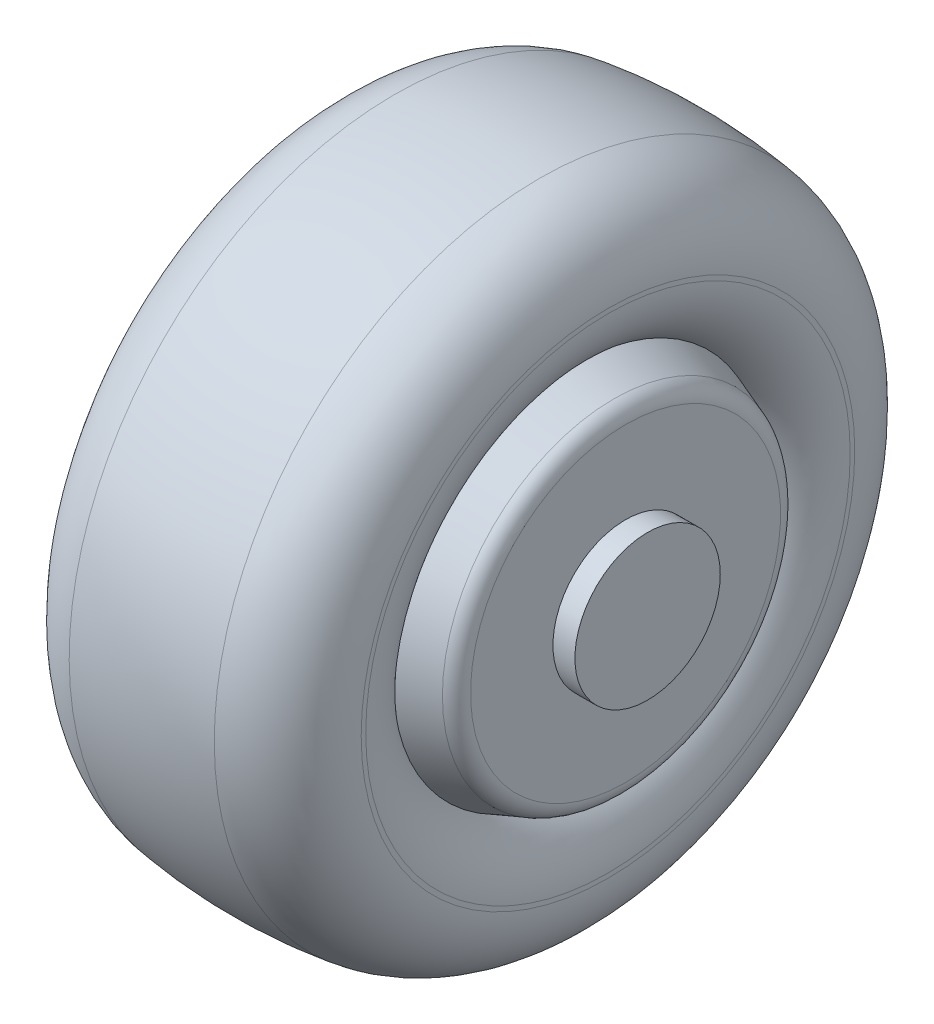
ISO-10303-21;
HEADER;
FILE_DESCRIPTION(('STEP AP214'),'2;1');
FILE_NAME('part.step','',(''),(''),'','','');
FILE_SCHEMA(('AUTOMOTIVE_DESIGN { 1 0 10303 214 1 1 1 1 }'));
ENDSEC;
DATA;
#1=APPLICATION_CONTEXT('core data for automotive mechanical design processes');
#2=APPLICATION_PROTOCOL_DEFINITION('international standard','automotive_design',2000,#1);
#3=PRODUCT_CONTEXT('',#1,'mechanical');
#4=PRODUCT('Part','Part','',(#3));
#5=PRODUCT_RELATED_PRODUCT_CATEGORY('part','',(#4));
#6=PRODUCT_DEFINITION_FORMATION('','',#4);
#7=PRODUCT_DEFINITION_CONTEXT('part definition',#1,'design');
#8=PRODUCT_DEFINITION('design','',#6,#7);
#9=PRODUCT_DEFINITION_SHAPE('','',#8);
#10=(LENGTH_UNIT() NAMED_UNIT(*) SI_UNIT(.MILLI.,.METRE.));
#11=(NAMED_UNIT(*) PLANE_ANGLE_UNIT() SI_UNIT($,.RADIAN.));
#12=(NAMED_UNIT(*) SI_UNIT($,.STERADIAN.) SOLID_ANGLE_UNIT());
#13=UNCERTAINTY_MEASURE_WITH_UNIT(LENGTH_MEASURE(1.E-05),#10,'distance_accuracy_value','');
#14=(GEOMETRIC_REPRESENTATION_CONTEXT(3) GLOBAL_UNCERTAINTY_ASSIGNED_CONTEXT((#13)) GLOBAL_UNIT_ASSIGNED_CONTEXT((#10,
#11,#12)) REPRESENTATION_CONTEXT('',''));
#15=CARTESIAN_POINT('',(0.,0.,0.));
#16=DIRECTION('',(0.,0.,1.));
#17=DIRECTION('',(1.,0.,0.));
#18=AXIS2_PLACEMENT_3D('',#15,#16,#17);
#19=CARTESIAN_POINT('',(20.5000021,0.,0.));
#20=DIRECTION('',(1.,0.,0.));
#21=DIRECTION('',(0.,0.,-1.));
#22=AXIS2_PLACEMENT_3D('',#19,#20,#21);
#23=PLANE('',#22);
#24=CARTESIAN_POINT('',(20.5000021,0.,0.));
#25=DIRECTION('',(1.,0.,0.));
#26=DIRECTION('',(0.,0.,-1.));
#27=AXIS2_PLACEMENT_3D('',#24,#25,#26);
#28=CIRCLE('',#27,8.25);
#29=CARTESIAN_POINT('',(20.5000021,0.,-8.25));
#30=VERTEX_POINT('',#29);
#31=EDGE_CURVE('E447',#30,#30,#28,.F.);
#32=ORIENTED_EDGE('',*,*,#31,.F.);
#33=EDGE_LOOP('',(#32));
#34=FACE_BOUND('',#33,.T.);
#35=ADVANCED_FACE('F17',(#34),#23,.T.);
#36=CARTESIAN_POINT('',(-20.5000021,0.,0.));
#37=DIRECTION('',(1.,0.,0.));
#38=DIRECTION('',(0.,0.,-1.));
#39=AXIS2_PLACEMENT_3D('',#36,#37,#38);
#40=PLANE('',#39);
#41=CARTESIAN_POINT('',(-20.5000021,0.,0.));
#42=DIRECTION('',(1.,0.,0.));
#43=DIRECTION('',(0.,0.,-1.));
#44=AXIS2_PLACEMENT_3D('',#41,#42,#43);
#45=CIRCLE('',#44,8.25);
#46=CARTESIAN_POINT('',(-20.5000021,0.,-8.25));
#47=VERTEX_POINT('',#46);
#48=EDGE_CURVE('E444',#47,#47,#45,.T.);
#49=ORIENTED_EDGE('',*,*,#48,.F.);
#50=EDGE_LOOP('',(#49));
#51=FACE_BOUND('',#50,.T.);
#52=ADVANCED_FACE('F160',(#51),#40,.F.);
#53=CARTESIAN_POINT('',(-22.55000231,0.,0.));
#54=DIRECTION('',(1.,0.,0.));
#55=DIRECTION('',(0.,0.,-1.));
#56=AXIS2_PLACEMENT_3D('',#53,#54,#55);
#57=CYLINDRICAL_SURFACE('',#56,8.25);
#58=ORIENTED_EDGE('',*,*,#31,.T.);
#59=EDGE_LOOP('',(#58));
#60=FACE_BOUND('',#59,.T.);
#61=CARTESIAN_POINT('',(18.0000021,0.,0.));
#62=DIRECTION('',(1.,0.,0.));
#63=DIRECTION('',(0.,0.,-1.));
#64=AXIS2_PLACEMENT_3D('',#61,#62,#63);
#65=CIRCLE('',#64,8.25);
#66=CARTESIAN_POINT('',(18.0000021,0.,-8.25));
#67=VERTEX_POINT('',#66);
#68=EDGE_CURVE('E442',#67,#67,#65,.F.);
#69=ORIENTED_EDGE('',*,*,#68,.F.);
#70=EDGE_LOOP('',(#69));
#71=FACE_BOUND('',#70,.T.);
#72=ADVANCED_FACE('F156',(#60,#71),#57,.T.);
#73=CARTESIAN_POINT('',(-22.55000231,0.,0.));
#74=DIRECTION('',(1.,0.,0.));
#75=DIRECTION('',(0.,0.,-1.));
#76=AXIS2_PLACEMENT_3D('',#73,#74,#75);
#77=CYLINDRICAL_SURFACE('',#76,8.25);
#78=ORIENTED_EDGE('',*,*,#48,.T.);
#79=EDGE_LOOP('',(#78));
#80=FACE_BOUND('',#79,.T.);
#81=CARTESIAN_POINT('',(-18.0000021,0.,0.));
#82=DIRECTION('',(1.,0.,0.));
#83=DIRECTION('',(0.,0.,-1.));
#84=AXIS2_PLACEMENT_3D('',#81,#82,#83);
#85=CIRCLE('',#84,8.25);
#86=CARTESIAN_POINT('',(-18.0000021,0.,-8.25));
#87=VERTEX_POINT('',#86);
#88=EDGE_CURVE('E74',#87,#87,#85,.F.);
#89=ORIENTED_EDGE('',*,*,#88,.T.);
#90=EDGE_LOOP('',(#89));
#91=FACE_BOUND('',#90,.T.);
#92=ADVANCED_FACE('F151',(#80,#91),#77,.T.);
#93=CARTESIAN_POINT('',(18.0000021,0.,0.));
#94=DIRECTION('',(1.,0.,0.));
#95=DIRECTION('',(0.,0.,-1.));
#96=AXIS2_PLACEMENT_3D('',#93,#94,#95);
#97=PLANE('',#96);
#98=ORIENTED_EDGE('',*,*,#68,.T.);
#99=EDGE_LOOP('',(#98));
#100=FACE_BOUND('',#99,.T.);
#101=CARTESIAN_POINT('',(18.000002100002,0.,0.));
#102=DIRECTION('',(-1.,0.,0.));
#103=DIRECTION('',(0.,-1.,0.));
#104=AXIS2_PLACEMENT_3D('',#101,#102,#103);
#105=CIRCLE('',#104,17.59960140316);
#106=CARTESIAN_POINT('',(18.0000021000012,-17.59960140316,0.));
#107=VERTEX_POINT('',#106);
#108=CARTESIAN_POINT('',(18.0000021000012,17.59960140316,0.));
#109=VERTEX_POINT('',#108);
#110=EDGE_CURVE('E72',#107,#109,#105,.T.);
#111=ORIENTED_EDGE('',*,*,#110,.F.);
#112=CARTESIAN_POINT('',(18.000002100002,0.,0.));
#113=DIRECTION('',(-1.,0.,0.));
#114=DIRECTION('',(0.,1.,0.));
#115=AXIS2_PLACEMENT_3D('',#112,#113,#114);
#116=CIRCLE('',#115,17.59960140316);
#117=EDGE_CURVE('E67',#109,#107,#116,.T.);
#118=ORIENTED_EDGE('',*,*,#117,.F.);
#119=EDGE_LOOP('',(#111,#118));
#120=FACE_BOUND('',#119,.T.);
#121=ADVANCED_FACE('F71',(#100,#120),#97,.T.);
#122=CARTESIAN_POINT('',(-18.0000021,0.,0.));
#123=DIRECTION('',(1.,0.,0.));
#124=DIRECTION('',(0.,0.,-1.));
#125=AXIS2_PLACEMENT_3D('',#122,#123,#124);
#126=PLANE('',#125);
#127=ORIENTED_EDGE('',*,*,#88,.F.);
#128=EDGE_LOOP('',(#127));
#129=FACE_BOUND('',#128,.T.);
#130=CARTESIAN_POINT('',(-18.000002099996,0.,0.));
#131=DIRECTION('',(1.,0.,0.));
#132=DIRECTION('',(0.,-1.,0.));
#133=AXIS2_PLACEMENT_3D('',#130,#131,#132);
#134=CIRCLE('',#133,17.59959215869);
#135=CARTESIAN_POINT('',(-18.0000020999976,-17.59959215869,0.));
#136=VERTEX_POINT('',#135);
#137=CARTESIAN_POINT('',(-18.0000020999976,17.59959215869,0.));
#138=VERTEX_POINT('',#137);
#139=EDGE_CURVE('E114',#136,#138,#134,.T.);
#140=ORIENTED_EDGE('',*,*,#139,.F.);
#141=CARTESIAN_POINT('',(-18.000002099996,0.,0.));
#142=DIRECTION('',(1.,0.,0.));
#143=DIRECTION('',(0.,1.,0.));
#144=AXIS2_PLACEMENT_3D('',#141,#142,#143);
#145=CIRCLE('',#144,17.59959215869);
#146=EDGE_CURVE('E80',#138,#136,#145,.T.);
#147=ORIENTED_EDGE('',*,*,#146,.F.);
#148=EDGE_LOOP('',(#140,#147));
#149=FACE_BOUND('',#148,.T.);
#150=ADVANCED_FACE('F100',(#129,#149),#126,.F.);
#151=CARTESIAN_POINT('',(16.00000209977,0.,0.));
#152=DIRECTION('',(1.,0.,0.));
#153=DIRECTION('',(0.,-1.,0.));
#154=AXIS2_PLACEMENT_3D('',#151,#152,#153);
#155=TOROIDAL_SURFACE('',#154,17.59960140316,2.000000000232);
#156=ORIENTED_EDGE('',*,*,#117,.T.);
#157=ORIENTED_EDGE('',*,*,#110,.T.);
#158=EDGE_LOOP('',(#156,#157));
#159=FACE_BOUND('',#158,.T.);
#160=CARTESIAN_POINT('',(16.6840353515506,0.,0.));
#161=DIRECTION('',(-1.,0.,0.));
#162=DIRECTION('',(0.,1.,0.));
#163=AXIS2_PLACEMENT_3D('',#160,#161,#162);
#164=CIRCLE('',#163,19.4789892054143);
#165=CARTESIAN_POINT('',(16.6840353515507,19.4789892054143,0.));
#166=VERTEX_POINT('',#165);
#167=EDGE_CURVE('E109',#166,#166,#164,.T.);
#168=ORIENTED_EDGE('',*,*,#167,.F.);
#169=EDGE_LOOP('',(#168));
#170=FACE_BOUND('',#169,.T.);
#171=ADVANCED_FACE('F78',(#159,#170),#155,.T.);
#172=CARTESIAN_POINT('',(-16.00000210017,0.,0.));
#173=DIRECTION('',(1.,0.,0.));
#174=DIRECTION('',(0.,-1.,0.));
#175=AXIS2_PLACEMENT_3D('',#172,#173,#174);
#176=TOROIDAL_SURFACE('',#175,17.59959215869,1.999999999826);
#177=ORIENTED_EDGE('',*,*,#146,.T.);
#178=ORIENTED_EDGE('',*,*,#139,.T.);
#179=EDGE_LOOP('',(#177,#178));
#180=FACE_BOUND('',#179,.T.);
#181=CARTESIAN_POINT('',(-16.6840381883665,0.,0.));
#182=DIRECTION('',(1.,0.,0.));
#183=DIRECTION('',(0.,-1.,0.));
#184=AXIS2_PLACEMENT_3D('',#181,#182,#183);
#185=CIRCLE('',#184,19.4789789281603);
#186=CARTESIAN_POINT('',(-16.6840381883665,-19.4789789281603,0.));
#187=VERTEX_POINT('',#186);
#188=EDGE_CURVE('E292',#187,#187,#185,.T.);
#189=ORIENTED_EDGE('',*,*,#188,.F.);
#190=EDGE_LOOP('',(#189));
#191=FACE_BOUND('',#190,.T.);
#192=ADVANCED_FACE('F99',(#180,#191),#176,.T.);
#193=CARTESIAN_POINT('',(12.6099945575885,0.,0.));
#194=DIRECTION('',(-1.,0.,0.));
#195=DIRECTION('',(0.,0.,1.));
#196=AXIS2_PLACEMENT_3D('',#193,#194,#195);
#197=CONICAL_SURFACE('',#196,20.961801516746,0.349062107046291);
#198=ORIENTED_EDGE('',*,*,#167,.T.);
#199=EDGE_LOOP('',(#198));
#200=FACE_BOUND('',#199,.T.);
#201=CARTESIAN_POINT('',(12.609994557591,0.,0.));
#202=DIRECTION('',(1.,0.,0.));
#203=DIRECTION('',(0.,-1.,0.));
#204=AXIS2_PLACEMENT_3D('',#201,#202,#203);
#205=CIRCLE('',#204,20.9618015167486);
#206=CARTESIAN_POINT('',(12.609994557591,-20.9618015167486,0.));
#207=VERTEX_POINT('',#206);
#208=EDGE_CURVE('E289',#207,#207,#205,.F.);
#209=ORIENTED_EDGE('',*,*,#208,.F.);
#210=EDGE_LOOP('',(#209));
#211=FACE_BOUND('',#210,.T.);
#212=ADVANCED_FACE('F318',(#200,#211),#197,.T.);
#213=CARTESIAN_POINT('',(-12.609999212348,0.,0.));
#214=DIRECTION('',(1.,0.,0.));
#215=DIRECTION('',(0.,0.,-1.));
#216=AXIS2_PLACEMENT_3D('',#213,#214,#215);
#217=CONICAL_SURFACE('',#216,20.9617975423545,0.349063616567947);
#218=ORIENTED_EDGE('',*,*,#188,.T.);
#219=EDGE_LOOP('',(#218));
#220=FACE_BOUND('',#219,.T.);
#221=CARTESIAN_POINT('',(-12.6099992123504,0.,0.));
#222=DIRECTION('',(1.,0.,0.));
#223=DIRECTION('',(0.,-1.,0.));
#224=AXIS2_PLACEMENT_3D('',#221,#222,#223);
#225=CIRCLE('',#224,20.9617975423594);
#226=CARTESIAN_POINT('',(-12.6099992123504,-20.9617975423594,0.));
#227=VERTEX_POINT('',#226);
#228=EDGE_CURVE('E280',#227,#227,#225,.T.);
#229=ORIENTED_EDGE('',*,*,#228,.F.);
#230=EDGE_LOOP('',(#229));
#231=FACE_BOUND('',#230,.T.);
#232=ADVANCED_FACE('F322',(#220,#231),#217,.T.);
#233=CARTESIAN_POINT('',(7.9999977,0.,0.));
#234=DIRECTION('',(1.,0.,0.));
#235=DIRECTION('',(0.,-1.,0.));
#236=AXIS2_PLACEMENT_3D('',#233,#234,#235);
#237=TOROIDAL_SURFACE('',#236,27.4999958,8.000003469533);
#238=ORIENTED_EDGE('',*,*,#208,.T.);
#239=EDGE_LOOP('',(#238));
#240=FACE_BOUND('',#239,.T.);
#241=CARTESIAN_POINT('',(16.000001169533,0.,0.));
#242=DIRECTION('',(1.,0.,0.));
#243=DIRECTION('',(0.,1.,0.));
#244=AXIS2_PLACEMENT_3D('',#241,#242,#243);
#245=CIRCLE('',#244,27.4999958);
#246=CARTESIAN_POINT('',(16.0000041347665,-27.4999958,0.));
#247=VERTEX_POINT('',#246);
#248=CARTESIAN_POINT('',(16.0000041347665,27.4999958,0.));
#249=VERTEX_POINT('',#248);
#250=EDGE_CURVE('E275',#247,#249,#245,.F.);
#251=ORIENTED_EDGE('',*,*,#250,.F.);
#252=CARTESIAN_POINT('',(16.000001169533,0.,0.));
#253=DIRECTION('',(1.,0.,0.));
#254=DIRECTION('',(0.,-1.,0.));
#255=AXIS2_PLACEMENT_3D('',#252,#253,#254);
#256=CIRCLE('',#255,27.4999958);
#257=EDGE_CURVE('E288',#249,#247,#256,.F.);
#258=ORIENTED_EDGE('',*,*,#257,.F.);
#259=EDGE_LOOP('',(#251,#258));
#260=FACE_BOUND('',#259,.T.);
#261=ADVANCED_FACE('F248',(#240,#260),#237,.T.);
#262=CARTESIAN_POINT('',(-7.9999977,0.,0.));
#263=DIRECTION('',(1.,0.,0.));
#264=DIRECTION('',(0.,-1.,0.));
#265=AXIS2_PLACEMENT_3D('',#262,#263,#264);
#266=TOROIDAL_SURFACE('',#265,27.4999958,8.0000094);
#267=ORIENTED_EDGE('',*,*,#228,.T.);
#268=EDGE_LOOP('',(#267));
#269=FACE_BOUND('',#268,.T.);
#270=CARTESIAN_POINT('',(-16.0000071,0.,0.));
#271=DIRECTION('',(-1.,0.,0.));
#272=DIRECTION('',(0.,1.,0.));
#273=AXIS2_PLACEMENT_3D('',#270,#271,#272);
#274=CIRCLE('',#273,27.4999958);
#275=CARTESIAN_POINT('',(-16.0000071,27.4999958,0.));
#276=VERTEX_POINT('',#275);
#277=CARTESIAN_POINT('',(-16.0000071,-27.4999958,0.));
#278=VERTEX_POINT('',#277);
#279=EDGE_CURVE('E262',#276,#278,#274,.T.);
#280=ORIENTED_EDGE('',*,*,#279,.T.);
#281=CARTESIAN_POINT('',(-16.0000071,0.,0.));
#282=DIRECTION('',(-1.,0.,0.));
#283=DIRECTION('',(0.,-1.,0.));
#284=AXIS2_PLACEMENT_3D('',#281,#282,#283);
#285=CIRCLE('',#284,27.4999958);
#286=EDGE_CURVE('E229',#278,#276,#285,.T.);
#287=ORIENTED_EDGE('',*,*,#286,.T.);
#288=EDGE_LOOP('',(#280,#287));
#289=FACE_BOUND('',#288,.T.);
#290=ADVANCED_FACE('F236',(#269,#289),#266,.T.);
#291=CARTESIAN_POINT('',(16.0000071,0.,0.));
#292=DIRECTION('',(1.,0.,0.));
#293=DIRECTION('',(0.,0.,-1.));
#294=AXIS2_PLACEMENT_3D('',#291,#292,#293);
#295=PLANE('',#294);
#296=ORIENTED_EDGE('',*,*,#257,.T.);
#297=ORIENTED_EDGE('',*,*,#250,.T.);
#298=EDGE_LOOP('',(#296,#297));
#299=FACE_BOUND('',#298,.T.);
#300=CARTESIAN_POINT('',(16.0000071,0.,0.));
#301=DIRECTION('',(-1.,0.,0.));
#302=DIRECTION('',(0.,1.,0.));
#303=AXIS2_PLACEMENT_3D('',#300,#301,#302);
#304=CIRCLE('',#303,28.01732689878);
#305=CARTESIAN_POINT('',(16.0000071,28.01732689878,0.));
#306=VERTEX_POINT('',#305);
#307=CARTESIAN_POINT('',(16.0000071,-28.01732689878,0.));
#308=VERTEX_POINT('',#307);
#309=EDGE_CURVE('E186',#306,#308,#304,.T.);
#310=ORIENTED_EDGE('',*,*,#309,.F.);
#311=CARTESIAN_POINT('',(16.0000071,0.,0.));
#312=DIRECTION('',(-1.,0.,0.));
#313=DIRECTION('',(0.,-1.,0.));
#314=AXIS2_PLACEMENT_3D('',#311,#312,#313);
#315=CIRCLE('',#314,28.01732689878);
#316=EDGE_CURVE('E217',#308,#306,#315,.T.);
#317=ORIENTED_EDGE('',*,*,#316,.F.);
#318=EDGE_LOOP('',(#310,#317));
#319=FACE_BOUND('',#318,.T.);
#320=ADVANCED_FACE('F247',(#299,#319),#295,.T.);
#321=CARTESIAN_POINT('',(-16.0000071,0.,0.));
#322=DIRECTION('',(1.,0.,0.));
#323=DIRECTION('',(0.,0.,-1.));
#324=AXIS2_PLACEMENT_3D('',#321,#322,#323);
#325=PLANE('',#324);
#326=ORIENTED_EDGE('',*,*,#286,.F.);
#327=ORIENTED_EDGE('',*,*,#279,.F.);
#328=EDGE_LOOP('',(#326,#327));
#329=FACE_BOUND('',#328,.T.);
#330=CARTESIAN_POINT('',(-16.0000071,0.,0.));
#331=DIRECTION('',(1.,0.,0.));
#332=DIRECTION('',(0.,-1.,0.));
#333=AXIS2_PLACEMENT_3D('',#330,#331,#332);
#334=CIRCLE('',#333,28.01732337919);
#335=CARTESIAN_POINT('',(-16.0000071,-28.01732337919,0.));
#336=VERTEX_POINT('',#335);
#337=CARTESIAN_POINT('',(-16.0000071,28.01732337919,0.));
#338=VERTEX_POINT('',#337);
#339=EDGE_CURVE('E184',#336,#338,#334,.T.);
#340=ORIENTED_EDGE('',*,*,#339,.F.);
#341=CARTESIAN_POINT('',(-16.0000071,0.,0.));
#342=DIRECTION('',(1.,0.,0.));
#343=DIRECTION('',(0.,1.,0.));
#344=AXIS2_PLACEMENT_3D('',#341,#342,#343);
#345=CIRCLE('',#344,28.01732337919);
#346=EDGE_CURVE('E37',#338,#336,#345,.T.);
#347=ORIENTED_EDGE('',*,*,#346,.F.);
#348=EDGE_LOOP('',(#340,#347));
#349=FACE_BOUND('',#348,.T.);
#350=ADVANCED_FACE('F346',(#329,#349),#325,.F.);
#351=CARTESIAN_POINT('',(7.0000071,0.,0.));
#352=DIRECTION('',(1.,0.,0.));
#353=DIRECTION('',(0.,-1.,0.));
#354=AXIS2_PLACEMENT_3D('',#351,#352,#353);
#355=TOROIDAL_SURFACE('',#354,28.01732689878,9.);
#356=CARTESIAN_POINT('',(8.23530003359825,0.,6.2376319387436E-12));
#357=DIRECTION('',(-1.,0.,0.));
#358=DIRECTION('',(0.,-0.998026728428283,0.062790519529136));
#359=AXIS2_PLACEMENT_3D('',#356,#357,#358);
#360=CIRCLE('',#359,36.9321489030744);
#361=CARTESIAN_POINT('',(8.23530003359793,-36.8592717435616,2.31898881695769));
#362=VERTEX_POINT('',#361);
#363=EDGE_CURVE('E29',#362,#362,#360,.T.);
#364=ORIENTED_EDGE('',*,*,#363,.F.);
#365=EDGE_LOOP('',(#364));
#366=FACE_BOUND('',#365,.T.);
#367=ORIENTED_EDGE('',*,*,#309,.T.);
#368=ORIENTED_EDGE('',*,*,#316,.T.);
#369=EDGE_LOOP('',(#367,#368));
#370=FACE_BOUND('',#369,.T.);
#371=ADVANCED_FACE('F176',(#366,#370),#355,.T.);
#372=CARTESIAN_POINT('',(-7.0000071,0.,0.));
#373=DIRECTION('',(1.,0.,0.));
#374=DIRECTION('',(0.,-1.,0.));
#375=AXIS2_PLACEMENT_3D('',#372,#373,#374);
#376=TOROIDAL_SURFACE('',#375,28.01732337919,9.);
#377=ORIENTED_EDGE('',*,*,#346,.T.);
#378=ORIENTED_EDGE('',*,*,#339,.T.);
#379=EDGE_LOOP('',(#377,#378));
#380=FACE_BOUND('',#379,.T.);
#381=CARTESIAN_POINT('',(-8.23530451595129,0.,7.95132189257419E-12));
#382=DIRECTION('',(1.,0.,0.));
#383=DIRECTION('',(0.,-0.998026728428285,0.0627905195290917));
#384=AXIS2_PLACEMENT_3D('',#381,#382,#383);
#385=CIRCLE('',#384,36.9321447623834);
#386=CARTESIAN_POINT('',(-8.23530451595095,-36.8592676110413,2.31898855696163));
#387=VERTEX_POINT('',#386);
#388=EDGE_CURVE('E11',#387,#387,#385,.T.);
#389=ORIENTED_EDGE('',*,*,#388,.F.);
#390=EDGE_LOOP('',(#389));
#391=FACE_BOUND('',#390,.T.);
#392=ADVANCED_FACE('F171',(#380,#391),#376,.T.);
#393=CARTESIAN_POINT('',(1.26999754305517E-05,0.,9.14546216534973E-12));
#394=DIRECTION('',(1.,0.,0.));
#395=DIRECTION('',(0.,1.,0.));
#396=AXIS2_PLACEMENT_3D('',#393,#394,#395);
#397=DEGENERATE_TOROIDAL_SURFACE('',#396,22.5000058002944,60.0000080845959,.F.);
#398=ORIENTED_EDGE('',*,*,#388,.T.);
#399=EDGE_LOOP('',(#398));
#400=FACE_BOUND('',#399,.T.);
#401=ORIENTED_EDGE('',*,*,#363,.T.);
#402=EDGE_LOOP('',(#401));
#403=FACE_BOUND('',#402,.T.);
#404=ADVANCED_FACE('F19',(#400,#403),#397,.F.);
#405=CLOSED_SHELL('',(#35,#52,#72,#92,#121,#150,#171,#192,#212,#232,#261,#290,#320,#350,#371,
#392,#404));
#406=MANIFOLD_SOLID_BREP('B1',#405);
#407=ADVANCED_BREP_SHAPE_REPRESENTATION('',(#18,#406),#14);
#408=SHAPE_DEFINITION_REPRESENTATION(#9,#407);
ENDSEC;
END-ISO-10303-21;
